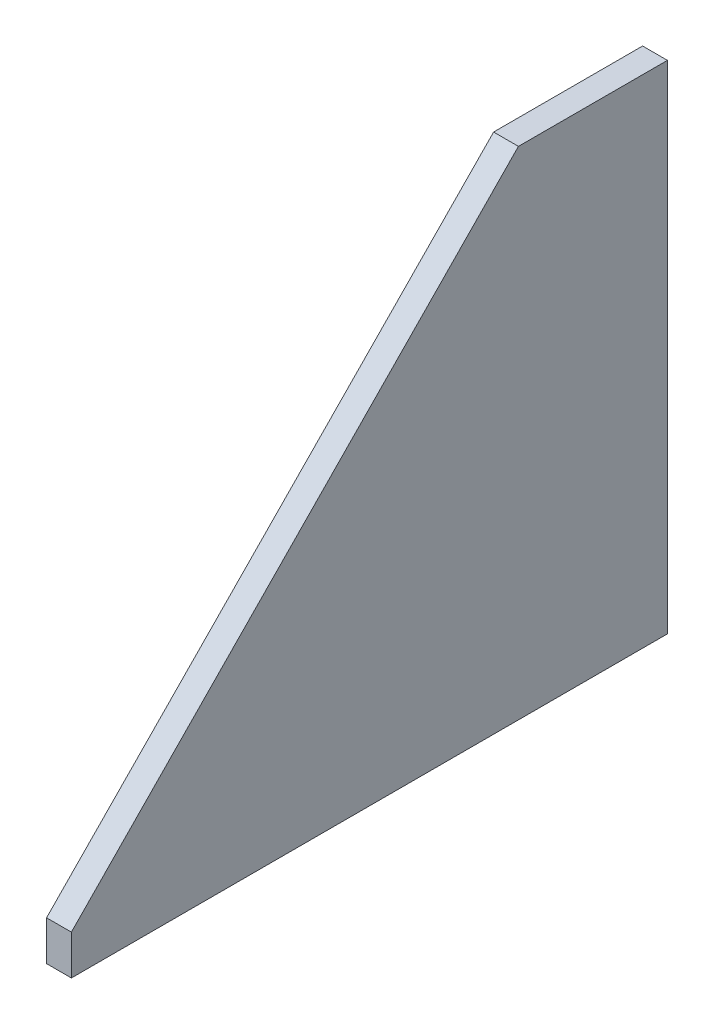
ISO-10303-21;
HEADER;
FILE_DESCRIPTION(('STEP AP214'),'2;1');
FILE_NAME('part.step','',(''),(''),'','','');
FILE_SCHEMA(('AUTOMOTIVE_DESIGN { 1 0 10303 214 1 1 1 1 }'));
ENDSEC;
DATA;
#1=APPLICATION_CONTEXT('core data for automotive mechanical design processes');
#2=APPLICATION_PROTOCOL_DEFINITION('international standard','automotive_design',2000,#1);
#3=PRODUCT_CONTEXT('',#1,'mechanical');
#4=PRODUCT('Part','Part','',(#3));
#5=PRODUCT_RELATED_PRODUCT_CATEGORY('part','',(#4));
#6=PRODUCT_DEFINITION_FORMATION('','',#4);
#7=PRODUCT_DEFINITION_CONTEXT('part definition',#1,'design');
#8=PRODUCT_DEFINITION('design','',#6,#7);
#9=PRODUCT_DEFINITION_SHAPE('','',#8);
#10=(LENGTH_UNIT() NAMED_UNIT(*) SI_UNIT(.MILLI.,.METRE.));
#11=(NAMED_UNIT(*) PLANE_ANGLE_UNIT() SI_UNIT($,.RADIAN.));
#12=(NAMED_UNIT(*) SI_UNIT($,.STERADIAN.) SOLID_ANGLE_UNIT());
#13=UNCERTAINTY_MEASURE_WITH_UNIT(LENGTH_MEASURE(1.E-05),#10,'distance_accuracy_value','');
#14=(GEOMETRIC_REPRESENTATION_CONTEXT(3) GLOBAL_UNCERTAINTY_ASSIGNED_CONTEXT((#13)) GLOBAL_UNIT_ASSIGNED_CONTEXT((#10,
#11,#12)) REPRESENTATION_CONTEXT('',''));
#15=CARTESIAN_POINT('',(0.,0.,0.));
#16=DIRECTION('',(0.,0.,1.));
#17=DIRECTION('',(1.,0.,0.));
#18=AXIS2_PLACEMENT_3D('',#15,#16,#17);
#19=CARTESIAN_POINT('',(2.5,8.,0.));
#20=DIRECTION('',(0.,0.,-1.));
#21=DIRECTION('',(-1.,0.,0.));
#22=AXIS2_PLACEMENT_3D('',#19,#20,#21);
#23=PLANE('',#22);
#24=DIRECTION('',(0.,-1.,0.));
#25=VECTOR('',#24,1.);
#26=CARTESIAN_POINT('',(-2.5,8.,0.));
#27=LINE('',#26,#25);
#28=CARTESIAN_POINT('',(-2.5,8.,0.));
#29=VERTEX_POINT('',#28);
#30=CARTESIAN_POINT('',(-2.5,0.,0.));
#31=VERTEX_POINT('',#30);
#32=EDGE_CURVE('E106',#29,#31,#27,.T.);
#33=ORIENTED_EDGE('',*,*,#32,.T.);
#34=DIRECTION('',(-1.,0.,0.));
#35=VECTOR('',#34,1.);
#36=CARTESIAN_POINT('',(2.5,0.,0.));
#37=LINE('',#36,#35);
#38=CARTESIAN_POINT('',(2.5,0.,0.));
#39=VERTEX_POINT('',#38);
#40=EDGE_CURVE('E11',#39,#31,#37,.T.);
#41=ORIENTED_EDGE('',*,*,#40,.F.);
#42=DIRECTION('',(0.,-1.,0.));
#43=VECTOR('',#42,1.);
#44=CARTESIAN_POINT('',(2.5,8.,0.));
#45=LINE('',#44,#43);
#46=CARTESIAN_POINT('',(2.5,8.,0.));
#47=VERTEX_POINT('',#46);
#48=EDGE_CURVE('E114',#47,#39,#45,.T.);
#49=ORIENTED_EDGE('',*,*,#48,.F.);
#50=DIRECTION('',(-1.,0.,0.));
#51=VECTOR('',#50,1.);
#52=CARTESIAN_POINT('',(2.5,8.,0.));
#53=LINE('',#52,#51);
#54=EDGE_CURVE('E102',#47,#29,#53,.T.);
#55=ORIENTED_EDGE('',*,*,#54,.T.);
#56=EDGE_LOOP('',(#33,#41,#49,#55));
#57=FACE_BOUND('',#56,.T.);
#58=ADVANCED_FACE('F32',(#57),#23,.F.);
#59=CARTESIAN_POINT('',(2.5,0.,0.));
#60=DIRECTION('',(0.,1.,0.));
#61=DIRECTION('',(0.,0.,1.));
#62=AXIS2_PLACEMENT_3D('',#59,#60,#61);
#63=PLANE('',#62);
#64=DIRECTION('',(0.,0.,-1.));
#65=VECTOR('',#64,1.);
#66=CARTESIAN_POINT('',(-2.5,0.,0.));
#67=LINE('',#66,#65);
#68=CARTESIAN_POINT('',(-2.5,0.,-120.));
#69=VERTEX_POINT('',#68);
#70=EDGE_CURVE('E109',#31,#69,#67,.T.);
#71=ORIENTED_EDGE('',*,*,#70,.T.);
#72=DIRECTION('',(-1.,0.,0.));
#73=VECTOR('',#72,1.);
#74=CARTESIAN_POINT('',(2.5,0.,-120.));
#75=LINE('',#74,#73);
#76=CARTESIAN_POINT('',(2.5,0.,-120.));
#77=VERTEX_POINT('',#76);
#78=EDGE_CURVE('E40',#77,#69,#75,.T.);
#79=ORIENTED_EDGE('',*,*,#78,.F.);
#80=DIRECTION('',(0.,0.,-1.));
#81=VECTOR('',#80,1.);
#82=CARTESIAN_POINT('',(2.5,0.,0.));
#83=LINE('',#82,#81);
#84=EDGE_CURVE('E82',#39,#77,#83,.T.);
#85=ORIENTED_EDGE('',*,*,#84,.F.);
#86=ORIENTED_EDGE('',*,*,#40,.T.);
#87=EDGE_LOOP('',(#71,#79,#85,#86));
#88=FACE_BOUND('',#87,.T.);
#89=ADVANCED_FACE('F133',(#88),#63,.F.);
#90=CARTESIAN_POINT('',(2.5,0.,-120.));
#91=DIRECTION('',(0.,0.,1.));
#92=DIRECTION('',(1.,0.,0.));
#93=AXIS2_PLACEMENT_3D('',#90,#91,#92);
#94=PLANE('',#93);
#95=DIRECTION('',(0.,1.,0.));
#96=VECTOR('',#95,1.);
#97=CARTESIAN_POINT('',(-2.5,0.,-120.));
#98=LINE('',#97,#96);
#99=CARTESIAN_POINT('',(-2.5,100.,-120.));
#100=VERTEX_POINT('',#99);
#101=EDGE_CURVE('E97',#69,#100,#98,.T.);
#102=ORIENTED_EDGE('',*,*,#101,.T.);
#103=DIRECTION('',(-1.,0.,0.));
#104=VECTOR('',#103,1.);
#105=CARTESIAN_POINT('',(2.5,100.,-120.));
#106=LINE('',#105,#104);
#107=CARTESIAN_POINT('',(2.5,100.,-120.));
#108=VERTEX_POINT('',#107);
#109=EDGE_CURVE('E94',#108,#100,#106,.T.);
#110=ORIENTED_EDGE('',*,*,#109,.F.);
#111=DIRECTION('',(0.,1.,0.));
#112=VECTOR('',#111,1.);
#113=CARTESIAN_POINT('',(2.5,0.,-120.));
#114=LINE('',#113,#112);
#115=EDGE_CURVE('E86',#77,#108,#114,.T.);
#116=ORIENTED_EDGE('',*,*,#115,.F.);
#117=ORIENTED_EDGE('',*,*,#78,.T.);
#118=EDGE_LOOP('',(#102,#110,#116,#117));
#119=FACE_BOUND('',#118,.T.);
#120=ADVANCED_FACE('F95',(#119),#94,.F.);
#121=CARTESIAN_POINT('',(2.5,100.,-120.));
#122=DIRECTION('',(0.,-1.,0.));
#123=DIRECTION('',(0.,0.,-1.));
#124=AXIS2_PLACEMENT_3D('',#121,#122,#123);
#125=PLANE('',#124);
#126=DIRECTION('',(0.,0.,1.));
#127=VECTOR('',#126,1.);
#128=CARTESIAN_POINT('',(-2.5,100.,-120.));
#129=LINE('',#128,#127);
#130=CARTESIAN_POINT('',(-2.5,100.,-90.));
#131=VERTEX_POINT('',#130);
#132=EDGE_CURVE('E68',#100,#131,#129,.T.);
#133=ORIENTED_EDGE('',*,*,#132,.T.);
#134=DIRECTION('',(-1.,0.,0.));
#135=VECTOR('',#134,1.);
#136=CARTESIAN_POINT('',(2.5,100.,-90.));
#137=LINE('',#136,#135);
#138=CARTESIAN_POINT('',(2.5,100.,-90.));
#139=VERTEX_POINT('',#138);
#140=EDGE_CURVE('E98',#139,#131,#137,.T.);
#141=ORIENTED_EDGE('',*,*,#140,.F.);
#142=DIRECTION('',(0.,0.,1.));
#143=VECTOR('',#142,1.);
#144=CARTESIAN_POINT('',(2.5,100.,-120.));
#145=LINE('',#144,#143);
#146=EDGE_CURVE('E90',#108,#139,#145,.T.);
#147=ORIENTED_EDGE('',*,*,#146,.F.);
#148=ORIENTED_EDGE('',*,*,#109,.T.);
#149=EDGE_LOOP('',(#133,#141,#147,#148));
#150=FACE_BOUND('',#149,.T.);
#151=ADVANCED_FACE('F100',(#150),#125,.F.);
#152=CARTESIAN_POINT('',(2.5,100.,-90.));
#153=DIRECTION('',(0.,-0.699294155463731,-0.714834025585147));
#154=DIRECTION('',(0.,0.714834025585147,-0.699294155463731));
#155=AXIS2_PLACEMENT_3D('',#152,#153,#154);
#156=PLANE('',#155);
#157=DIRECTION('',(0.,-0.714834025585147,0.699294155463731));
#158=VECTOR('',#157,1.);
#159=CARTESIAN_POINT('',(-2.5,100.,-90.));
#160=LINE('',#159,#158);
#161=EDGE_CURVE('E74',#131,#29,#160,.T.);
#162=ORIENTED_EDGE('',*,*,#161,.T.);
#163=ORIENTED_EDGE('',*,*,#54,.F.);
#164=DIRECTION('',(0.,-0.714834025585147,0.699294155463731));
#165=VECTOR('',#164,1.);
#166=CARTESIAN_POINT('',(2.5,100.,-90.));
#167=LINE('',#166,#165);
#168=EDGE_CURVE('E48',#139,#47,#167,.T.);
#169=ORIENTED_EDGE('',*,*,#168,.F.);
#170=ORIENTED_EDGE('',*,*,#140,.T.);
#171=EDGE_LOOP('',(#162,#163,#169,#170));
#172=FACE_BOUND('',#171,.T.);
#173=ADVANCED_FACE('F122',(#172),#156,.F.);
#174=CARTESIAN_POINT('',(2.5,0.,0.));
#175=DIRECTION('',(1.,0.,0.));
#176=DIRECTION('',(0.,0.,-1.));
#177=AXIS2_PLACEMENT_3D('',#174,#175,#176);
#178=PLANE('',#177);
#179=ORIENTED_EDGE('',*,*,#48,.T.);
#180=ORIENTED_EDGE('',*,*,#84,.T.);
#181=ORIENTED_EDGE('',*,*,#115,.T.);
#182=ORIENTED_EDGE('',*,*,#146,.T.);
#183=ORIENTED_EDGE('',*,*,#168,.T.);
#184=EDGE_LOOP('',(#179,#180,#181,#182,#183));
#185=FACE_BOUND('',#184,.T.);
#186=ADVANCED_FACE('F88',(#185),#178,.T.);
#187=CARTESIAN_POINT('',(-2.5,0.,0.));
#188=DIRECTION('',(1.,0.,0.));
#189=DIRECTION('',(0.,0.,-1.));
#190=AXIS2_PLACEMENT_3D('',#187,#188,#189);
#191=PLANE('',#190);
#192=ORIENTED_EDGE('',*,*,#32,.F.);
#193=ORIENTED_EDGE('',*,*,#161,.F.);
#194=ORIENTED_EDGE('',*,*,#132,.F.);
#195=ORIENTED_EDGE('',*,*,#101,.F.);
#196=ORIENTED_EDGE('',*,*,#70,.F.);
#197=EDGE_LOOP('',(#192,#193,#194,#195,#196));
#198=FACE_BOUND('',#197,.T.);
#199=ADVANCED_FACE('F118',(#198),#191,.F.);
#200=CLOSED_SHELL('',(#58,#89,#120,#151,#173,#186,#199));
#201=MANIFOLD_SOLID_BREP('B2',#200);
#202=ADVANCED_BREP_SHAPE_REPRESENTATION('',(#18,#201),#14);
#203=SHAPE_DEFINITION_REPRESENTATION(#9,#202);
ENDSEC;
END-ISO-10303-21;
